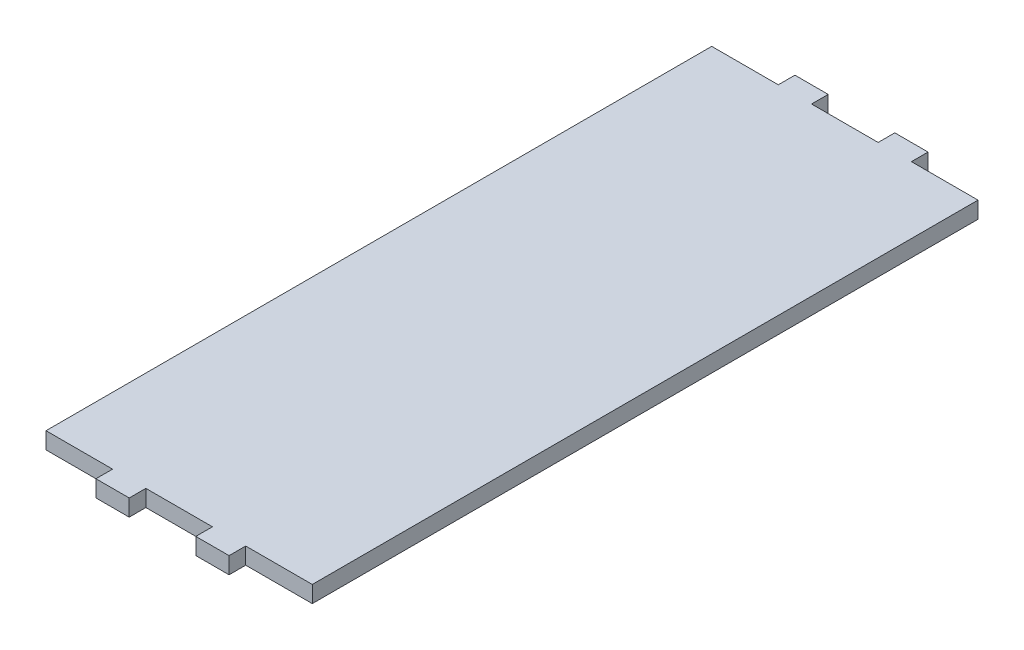
ISO-10303-21;
HEADER;
FILE_DESCRIPTION(('STEP AP214'),'2;1');
FILE_NAME('part.step','',(''),(''),'','','');
FILE_SCHEMA(('AUTOMOTIVE_DESIGN { 1 0 10303 214 1 1 1 1 }'));
ENDSEC;
DATA;
#1=APPLICATION_CONTEXT('core data for automotive mechanical design processes');
#2=APPLICATION_PROTOCOL_DEFINITION('international standard','automotive_design',2000,#1);
#3=PRODUCT_CONTEXT('',#1,'mechanical');
#4=PRODUCT('Part','Part','',(#3));
#5=PRODUCT_RELATED_PRODUCT_CATEGORY('part','',(#4));
#6=PRODUCT_DEFINITION_FORMATION('','',#4);
#7=PRODUCT_DEFINITION_CONTEXT('part definition',#1,'design');
#8=PRODUCT_DEFINITION('design','',#6,#7);
#9=PRODUCT_DEFINITION_SHAPE('','',#8);
#10=(LENGTH_UNIT() NAMED_UNIT(*) SI_UNIT(.MILLI.,.METRE.));
#11=(NAMED_UNIT(*) PLANE_ANGLE_UNIT() SI_UNIT($,.RADIAN.));
#12=(NAMED_UNIT(*) SI_UNIT($,.STERADIAN.) SOLID_ANGLE_UNIT());
#13=UNCERTAINTY_MEASURE_WITH_UNIT(LENGTH_MEASURE(1.E-05),#10,'distance_accuracy_value','');
#14=(GEOMETRIC_REPRESENTATION_CONTEXT(3) GLOBAL_UNCERTAINTY_ASSIGNED_CONTEXT((#13)) GLOBAL_UNIT_ASSIGNED_CONTEXT((#10,
#11,#12)) REPRESENTATION_CONTEXT('',''));
#15=CARTESIAN_POINT('',(0.,0.,0.));
#16=DIRECTION('',(0.,0.,1.));
#17=DIRECTION('',(1.,0.,0.));
#18=AXIS2_PLACEMENT_3D('',#15,#16,#17);
#19=CARTESIAN_POINT('',(25.4,3.175,0.));
#20=DIRECTION('',(1.,0.,0.));
#21=DIRECTION('',(0.,0.,-1.));
#22=AXIS2_PLACEMENT_3D('',#19,#20,#21);
#23=PLANE('',#22);
#24=DIRECTION('',(0.,0.,1.));
#25=VECTOR('',#24,1.);
#26=CARTESIAN_POINT('',(25.4,0.,0.));
#27=LINE('',#26,#25);
#28=CARTESIAN_POINT('',(25.4,0.,-63.5000000000001));
#29=VERTEX_POINT('',#28);
#30=CARTESIAN_POINT('',(25.4,0.,63.4999999999999));
#31=VERTEX_POINT('',#30);
#32=EDGE_CURVE('E202',#29,#31,#27,.T.);
#33=ORIENTED_EDGE('',*,*,#32,.F.);
#34=DIRECTION('',(0.,-1.,0.));
#35=VECTOR('',#34,1.);
#36=CARTESIAN_POINT('',(25.4,3.175,-63.5000000000001));
#37=LINE('',#36,#35);
#38=CARTESIAN_POINT('',(25.4,3.175,-63.5000000000001));
#39=VERTEX_POINT('',#38);
#40=EDGE_CURVE('E11',#39,#29,#37,.T.);
#41=ORIENTED_EDGE('',*,*,#40,.F.);
#42=DIRECTION('',(0.,0.,1.));
#43=VECTOR('',#42,1.);
#44=CARTESIAN_POINT('',(25.4,3.175,0.));
#45=LINE('',#44,#43);
#46=CARTESIAN_POINT('',(25.4,3.175,63.4999999999999));
#47=VERTEX_POINT('',#46);
#48=EDGE_CURVE('E296',#39,#47,#45,.T.);
#49=ORIENTED_EDGE('',*,*,#48,.T.);
#50=DIRECTION('',(0.,-1.,0.));
#51=VECTOR('',#50,1.);
#52=CARTESIAN_POINT('',(25.4,3.175,63.4999999999999));
#53=LINE('',#52,#51);
#54=EDGE_CURVE('E121',#47,#31,#53,.T.);
#55=ORIENTED_EDGE('',*,*,#54,.T.);
#56=EDGE_LOOP('',(#33,#41,#49,#55));
#57=FACE_BOUND('',#56,.T.);
#58=ADVANCED_FACE('F35',(#57),#23,.T.);
#59=CARTESIAN_POINT('',(0.,3.175,-63.5000000000001));
#60=DIRECTION('',(0.,0.,-1.));
#61=DIRECTION('',(-1.,0.,0.));
#62=AXIS2_PLACEMENT_3D('',#59,#60,#61);
#63=PLANE('',#62);
#64=DIRECTION('',(1.,0.,0.));
#65=VECTOR('',#64,1.);
#66=CARTESIAN_POINT('',(0.,0.,-63.5000000000001));
#67=LINE('',#66,#65);
#68=CARTESIAN_POINT('',(12.7,0.,-63.5000000000001));
#69=VERTEX_POINT('',#68);
#70=EDGE_CURVE('E205',#69,#29,#67,.T.);
#71=ORIENTED_EDGE('',*,*,#70,.F.);
#72=DIRECTION('',(0.,-1.,0.));
#73=VECTOR('',#72,1.);
#74=CARTESIAN_POINT('',(12.7,3.175,-63.5000000000001));
#75=LINE('',#74,#73);
#76=CARTESIAN_POINT('',(12.7,3.175,-63.5000000000001));
#77=VERTEX_POINT('',#76);
#78=EDGE_CURVE('E43',#77,#69,#75,.T.);
#79=ORIENTED_EDGE('',*,*,#78,.F.);
#80=DIRECTION('',(1.,0.,0.));
#81=VECTOR('',#80,1.);
#82=CARTESIAN_POINT('',(0.,3.175,-63.5000000000001));
#83=LINE('',#82,#81);
#84=EDGE_CURVE('E295',#77,#39,#83,.T.);
#85=ORIENTED_EDGE('',*,*,#84,.T.);
#86=ORIENTED_EDGE('',*,*,#40,.T.);
#87=EDGE_LOOP('',(#71,#79,#85,#86));
#88=FACE_BOUND('',#87,.T.);
#89=ADVANCED_FACE('F294',(#88),#63,.T.);
#90=CARTESIAN_POINT('',(12.7,3.175,0.));
#91=DIRECTION('',(-1.,0.,0.));
#92=DIRECTION('',(0.,0.,1.));
#93=AXIS2_PLACEMENT_3D('',#90,#91,#92);
#94=PLANE('',#93);
#95=DIRECTION('',(0.,0.,-1.));
#96=VECTOR('',#95,1.);
#97=CARTESIAN_POINT('',(12.7,0.,0.));
#98=LINE('',#97,#96);
#99=CARTESIAN_POINT('',(12.7,0.,-66.6750000000001));
#100=VERTEX_POINT('',#99);
#101=EDGE_CURVE('E208',#69,#100,#98,.T.);
#102=ORIENTED_EDGE('',*,*,#101,.T.);
#103=DIRECTION('',(0.,-1.,0.));
#104=VECTOR('',#103,1.);
#105=CARTESIAN_POINT('',(12.7,3.175,-66.6750000000001));
#106=LINE('',#105,#104);
#107=CARTESIAN_POINT('',(12.7,3.175,-66.6750000000001));
#108=VERTEX_POINT('',#107);
#109=EDGE_CURVE('E280',#108,#100,#106,.T.);
#110=ORIENTED_EDGE('',*,*,#109,.F.);
#111=DIRECTION('',(0.,0.,-1.));
#112=VECTOR('',#111,1.);
#113=CARTESIAN_POINT('',(12.7,3.175,0.));
#114=LINE('',#113,#112);
#115=EDGE_CURVE('E286',#77,#108,#114,.T.);
#116=ORIENTED_EDGE('',*,*,#115,.F.);
#117=ORIENTED_EDGE('',*,*,#78,.T.);
#118=EDGE_LOOP('',(#102,#110,#116,#117));
#119=FACE_BOUND('',#118,.T.);
#120=ADVANCED_FACE('F284',(#119),#94,.F.);
#121=CARTESIAN_POINT('',(-1.45716771982052E-13,3.175,-66.675));
#122=DIRECTION('',(0.,0.,-1.));
#123=DIRECTION('',(-1.,0.,0.));
#124=AXIS2_PLACEMENT_3D('',#121,#122,#123);
#125=PLANE('',#124);
#126=DIRECTION('',(1.,0.,0.));
#127=VECTOR('',#126,1.);
#128=CARTESIAN_POINT('',(-1.45716771982052E-13,0.,-66.675));
#129=LINE('',#128,#127);
#130=CARTESIAN_POINT('',(6.35,0.,-66.675));
#131=VERTEX_POINT('',#130);
#132=EDGE_CURVE('E213',#131,#100,#129,.T.);
#133=ORIENTED_EDGE('',*,*,#132,.F.);
#134=DIRECTION('',(0.,-1.,0.));
#135=VECTOR('',#134,1.);
#136=CARTESIAN_POINT('',(6.35,3.175,-66.675));
#137=LINE('',#136,#135);
#138=CARTESIAN_POINT('',(6.35,3.175,-66.675));
#139=VERTEX_POINT('',#138);
#140=EDGE_CURVE('E278',#139,#131,#137,.T.);
#141=ORIENTED_EDGE('',*,*,#140,.F.);
#142=DIRECTION('',(1.,0.,0.));
#143=VECTOR('',#142,1.);
#144=CARTESIAN_POINT('',(-1.45716771982052E-13,3.175,-66.675));
#145=LINE('',#144,#143);
#146=EDGE_CURVE('E330',#139,#108,#145,.T.);
#147=ORIENTED_EDGE('',*,*,#146,.T.);
#148=ORIENTED_EDGE('',*,*,#109,.T.);
#149=EDGE_LOOP('',(#133,#141,#147,#148));
#150=FACE_BOUND('',#149,.T.);
#151=ADVANCED_FACE('F383',(#150),#125,.T.);
#152=CARTESIAN_POINT('',(6.35,3.175,0.));
#153=DIRECTION('',(-1.,0.,0.));
#154=DIRECTION('',(0.,0.,1.));
#155=AXIS2_PLACEMENT_3D('',#152,#153,#154);
#156=PLANE('',#155);
#157=DIRECTION('',(0.,0.,-1.));
#158=VECTOR('',#157,1.);
#159=CARTESIAN_POINT('',(6.35,0.,0.));
#160=LINE('',#159,#158);
#161=CARTESIAN_POINT('',(6.35,0.,-63.5000000000001));
#162=VERTEX_POINT('',#161);
#163=EDGE_CURVE('E216',#162,#131,#160,.T.);
#164=ORIENTED_EDGE('',*,*,#163,.F.);
#165=DIRECTION('',(0.,-1.,0.));
#166=VECTOR('',#165,1.);
#167=CARTESIAN_POINT('',(6.35,3.175,-63.5000000000001));
#168=LINE('',#167,#166);
#169=CARTESIAN_POINT('',(6.35,3.175,-63.5000000000001));
#170=VERTEX_POINT('',#169);
#171=EDGE_CURVE('E276',#170,#162,#168,.T.);
#172=ORIENTED_EDGE('',*,*,#171,.F.);
#173=DIRECTION('',(0.,0.,-1.));
#174=VECTOR('',#173,1.);
#175=CARTESIAN_POINT('',(6.35,3.175,0.));
#176=LINE('',#175,#174);
#177=EDGE_CURVE('E327',#170,#139,#176,.T.);
#178=ORIENTED_EDGE('',*,*,#177,.T.);
#179=ORIENTED_EDGE('',*,*,#140,.T.);
#180=EDGE_LOOP('',(#164,#172,#178,#179));
#181=FACE_BOUND('',#180,.T.);
#182=ADVANCED_FACE('F347',(#181),#156,.T.);
#183=CARTESIAN_POINT('',(-6.35,0.,-63.5000000000001));
#184=VERTEX_POINT('',#183);
#185=EDGE_CURVE('E210',#184,#162,#67,.T.);
#186=ORIENTED_EDGE('',*,*,#185,.F.);
#187=DIRECTION('',(0.,-1.,0.));
#188=VECTOR('',#187,1.);
#189=CARTESIAN_POINT('',(-6.35,3.175,-63.5000000000001));
#190=LINE('',#189,#188);
#191=CARTESIAN_POINT('',(-6.35,3.175,-63.5000000000001));
#192=VERTEX_POINT('',#191);
#193=EDGE_CURVE('E274',#192,#184,#190,.T.);
#194=ORIENTED_EDGE('',*,*,#193,.F.);
#195=EDGE_CURVE('E326',#192,#170,#83,.T.);
#196=ORIENTED_EDGE('',*,*,#195,.T.);
#197=ORIENTED_EDGE('',*,*,#171,.T.);
#198=EDGE_LOOP('',(#186,#194,#196,#197));
#199=FACE_BOUND('',#198,.T.);
#200=ADVANCED_FACE('F339',(#199),#63,.T.);
#201=CARTESIAN_POINT('',(-6.35,3.175,0.));
#202=DIRECTION('',(-1.,0.,0.));
#203=DIRECTION('',(0.,0.,1.));
#204=AXIS2_PLACEMENT_3D('',#201,#202,#203);
#205=PLANE('',#204);
#206=DIRECTION('',(0.,0.,-1.));
#207=VECTOR('',#206,1.);
#208=CARTESIAN_POINT('',(-6.35,0.,0.));
#209=LINE('',#208,#207);
#210=CARTESIAN_POINT('',(-6.35,0.,-66.675));
#211=VERTEX_POINT('',#210);
#212=EDGE_CURVE('E219',#184,#211,#209,.T.);
#213=ORIENTED_EDGE('',*,*,#212,.T.);
#214=DIRECTION('',(0.,-1.,0.));
#215=VECTOR('',#214,1.);
#216=CARTESIAN_POINT('',(-6.35,3.175,-66.675));
#217=LINE('',#216,#215);
#218=CARTESIAN_POINT('',(-6.35,3.175,-66.675));
#219=VERTEX_POINT('',#218);
#220=EDGE_CURVE('E272',#219,#211,#217,.T.);
#221=ORIENTED_EDGE('',*,*,#220,.F.);
#222=DIRECTION('',(0.,0.,-1.));
#223=VECTOR('',#222,1.);
#224=CARTESIAN_POINT('',(-6.35,3.175,0.));
#225=LINE('',#224,#223);
#226=EDGE_CURVE('E324',#192,#219,#225,.T.);
#227=ORIENTED_EDGE('',*,*,#226,.F.);
#228=ORIENTED_EDGE('',*,*,#193,.T.);
#229=EDGE_LOOP('',(#213,#221,#227,#228));
#230=FACE_BOUND('',#229,.T.);
#231=ADVANCED_FACE('F366',(#230),#205,.F.);
#232=CARTESIAN_POINT('',(1.45716771982052E-13,3.175,-66.675));
#233=DIRECTION('',(0.,0.,-1.));
#234=DIRECTION('',(-1.,0.,0.));
#235=AXIS2_PLACEMENT_3D('',#232,#233,#234);
#236=PLANE('',#235);
#237=DIRECTION('',(1.,0.,0.));
#238=VECTOR('',#237,1.);
#239=CARTESIAN_POINT('',(1.45716771982052E-13,0.,-66.675));
#240=LINE('',#239,#238);
#241=CARTESIAN_POINT('',(-12.7,0.,-66.6750000000001));
#242=VERTEX_POINT('',#241);
#243=EDGE_CURVE('E222',#242,#211,#240,.T.);
#244=ORIENTED_EDGE('',*,*,#243,.F.);
#245=DIRECTION('',(0.,-1.,0.));
#246=VECTOR('',#245,1.);
#247=CARTESIAN_POINT('',(-12.7,3.175,-66.6750000000001));
#248=LINE('',#247,#246);
#249=CARTESIAN_POINT('',(-12.7,3.175,-66.6750000000001));
#250=VERTEX_POINT('',#249);
#251=EDGE_CURVE('E270',#250,#242,#248,.T.);
#252=ORIENTED_EDGE('',*,*,#251,.F.);
#253=DIRECTION('',(1.,0.,0.));
#254=VECTOR('',#253,1.);
#255=CARTESIAN_POINT('',(1.45716771982052E-13,3.175,-66.675));
#256=LINE('',#255,#254);
#257=EDGE_CURVE('E321',#250,#219,#256,.T.);
#258=ORIENTED_EDGE('',*,*,#257,.T.);
#259=ORIENTED_EDGE('',*,*,#220,.T.);
#260=EDGE_LOOP('',(#244,#252,#258,#259));
#261=FACE_BOUND('',#260,.T.);
#262=ADVANCED_FACE('F364',(#261),#236,.T.);
#263=CARTESIAN_POINT('',(-12.7,3.175,0.));
#264=DIRECTION('',(-1.,0.,0.));
#265=DIRECTION('',(0.,0.,1.));
#266=AXIS2_PLACEMENT_3D('',#263,#264,#265);
#267=PLANE('',#266);
#268=DIRECTION('',(0.,0.,-1.));
#269=VECTOR('',#268,1.);
#270=CARTESIAN_POINT('',(-12.7,0.,0.));
#271=LINE('',#270,#269);
#272=CARTESIAN_POINT('',(-12.7,0.,-63.5000000000001));
#273=VERTEX_POINT('',#272);
#274=EDGE_CURVE('E225',#273,#242,#271,.T.);
#275=ORIENTED_EDGE('',*,*,#274,.F.);
#276=DIRECTION('',(0.,-1.,0.));
#277=VECTOR('',#276,1.);
#278=CARTESIAN_POINT('',(-12.7,3.175,-63.5000000000001));
#279=LINE('',#278,#277);
#280=CARTESIAN_POINT('',(-12.7,3.175,-63.5000000000001));
#281=VERTEX_POINT('',#280);
#282=EDGE_CURVE('E268',#281,#273,#279,.T.);
#283=ORIENTED_EDGE('',*,*,#282,.F.);
#284=DIRECTION('',(0.,0.,-1.));
#285=VECTOR('',#284,1.);
#286=CARTESIAN_POINT('',(-12.7,3.175,0.));
#287=LINE('',#286,#285);
#288=EDGE_CURVE('E318',#281,#250,#287,.T.);
#289=ORIENTED_EDGE('',*,*,#288,.T.);
#290=ORIENTED_EDGE('',*,*,#251,.T.);
#291=EDGE_LOOP('',(#275,#283,#289,#290));
#292=FACE_BOUND('',#291,.T.);
#293=ADVANCED_FACE('F361',(#292),#267,.T.);
#294=CARTESIAN_POINT('',(-25.4,0.,-63.5000000000001));
#295=VERTEX_POINT('',#294);
#296=EDGE_CURVE('E209',#295,#273,#67,.T.);
#297=ORIENTED_EDGE('',*,*,#296,.F.);
#298=DIRECTION('',(0.,-1.,0.));
#299=VECTOR('',#298,1.);
#300=CARTESIAN_POINT('',(-25.4,3.175,-63.5000000000001));
#301=LINE('',#300,#299);
#302=CARTESIAN_POINT('',(-25.4,3.175,-63.5000000000001));
#303=VERTEX_POINT('',#302);
#304=EDGE_CURVE('E266',#303,#295,#301,.T.);
#305=ORIENTED_EDGE('',*,*,#304,.F.);
#306=EDGE_CURVE('E317',#303,#281,#83,.T.);
#307=ORIENTED_EDGE('',*,*,#306,.T.);
#308=ORIENTED_EDGE('',*,*,#282,.T.);
#309=EDGE_LOOP('',(#297,#305,#307,#308));
#310=FACE_BOUND('',#309,.T.);
#311=ADVANCED_FACE('F356',(#310),#63,.T.);
#312=CARTESIAN_POINT('',(-25.4,3.175,0.));
#313=DIRECTION('',(1.,0.,0.));
#314=DIRECTION('',(0.,0.,-1.));
#315=AXIS2_PLACEMENT_3D('',#312,#313,#314);
#316=PLANE('',#315);
#317=DIRECTION('',(0.,0.,1.));
#318=VECTOR('',#317,1.);
#319=CARTESIAN_POINT('',(-25.4,0.,0.));
#320=LINE('',#319,#318);
#321=CARTESIAN_POINT('',(-25.4,0.,63.4999999999999));
#322=VERTEX_POINT('',#321);
#323=EDGE_CURVE('E228',#295,#322,#320,.T.);
#324=ORIENTED_EDGE('',*,*,#323,.T.);
#325=DIRECTION('',(0.,-1.,0.));
#326=VECTOR('',#325,1.);
#327=CARTESIAN_POINT('',(-25.4,3.175,63.4999999999999));
#328=LINE('',#327,#326);
#329=CARTESIAN_POINT('',(-25.4,3.175,63.4999999999999));
#330=VERTEX_POINT('',#329);
#331=EDGE_CURVE('E263',#330,#322,#328,.T.);
#332=ORIENTED_EDGE('',*,*,#331,.F.);
#333=DIRECTION('',(0.,0.,1.));
#334=VECTOR('',#333,1.);
#335=CARTESIAN_POINT('',(-25.4,3.175,0.));
#336=LINE('',#335,#334);
#337=EDGE_CURVE('E315',#303,#330,#336,.T.);
#338=ORIENTED_EDGE('',*,*,#337,.F.);
#339=ORIENTED_EDGE('',*,*,#304,.T.);
#340=EDGE_LOOP('',(#324,#332,#338,#339));
#341=FACE_BOUND('',#340,.T.);
#342=ADVANCED_FACE('F387',(#341),#316,.F.);
#343=CARTESIAN_POINT('',(0.,3.175,63.4999999999999));
#344=DIRECTION('',(0.,0.,-1.));
#345=DIRECTION('',(-1.,0.,0.));
#346=AXIS2_PLACEMENT_3D('',#343,#344,#345);
#347=PLANE('',#346);
#348=DIRECTION('',(1.,0.,0.));
#349=VECTOR('',#348,1.);
#350=CARTESIAN_POINT('',(0.,0.,63.4999999999999));
#351=LINE('',#350,#349);
#352=CARTESIAN_POINT('',(-12.7,0.,63.4999999999999));
#353=VERTEX_POINT('',#352);
#354=EDGE_CURVE('E230',#322,#353,#351,.T.);
#355=ORIENTED_EDGE('',*,*,#354,.T.);
#356=DIRECTION('',(0.,-1.,0.));
#357=VECTOR('',#356,1.);
#358=CARTESIAN_POINT('',(-12.7,3.175,63.4999999999999));
#359=LINE('',#358,#357);
#360=CARTESIAN_POINT('',(-12.7,3.175,63.4999999999999));
#361=VERTEX_POINT('',#360);
#362=EDGE_CURVE('E260',#361,#353,#359,.T.);
#363=ORIENTED_EDGE('',*,*,#362,.F.);
#364=DIRECTION('',(1.,0.,0.));
#365=VECTOR('',#364,1.);
#366=CARTESIAN_POINT('',(0.,3.175,63.4999999999999));
#367=LINE('',#366,#365);
#368=EDGE_CURVE('E199',#330,#361,#367,.T.);
#369=ORIENTED_EDGE('',*,*,#368,.F.);
#370=ORIENTED_EDGE('',*,*,#331,.T.);
#371=EDGE_LOOP('',(#355,#363,#369,#370));
#372=FACE_BOUND('',#371,.T.);
#373=ADVANCED_FACE('F392',(#372),#347,.F.);
#374=CARTESIAN_POINT('',(-12.7,3.175,0.));
#375=DIRECTION('',(1.,0.,0.));
#376=DIRECTION('',(0.,0.,-1.));
#377=AXIS2_PLACEMENT_3D('',#374,#375,#376);
#378=PLANE('',#377);
#379=DIRECTION('',(0.,0.,1.));
#380=VECTOR('',#379,1.);
#381=CARTESIAN_POINT('',(-12.7,0.,0.));
#382=LINE('',#381,#380);
#383=CARTESIAN_POINT('',(-12.7,0.,66.6749999999999));
#384=VERTEX_POINT('',#383);
#385=EDGE_CURVE('E232',#353,#384,#382,.T.);
#386=ORIENTED_EDGE('',*,*,#385,.T.);
#387=DIRECTION('',(0.,-1.,0.));
#388=VECTOR('',#387,1.);
#389=CARTESIAN_POINT('',(-12.7,3.175,66.6749999999999));
#390=LINE('',#389,#388);
#391=CARTESIAN_POINT('',(-12.7,3.175,66.6749999999999));
#392=VERTEX_POINT('',#391);
#393=EDGE_CURVE('E257',#392,#384,#390,.T.);
#394=ORIENTED_EDGE('',*,*,#393,.F.);
#395=DIRECTION('',(0.,0.,1.));
#396=VECTOR('',#395,1.);
#397=CARTESIAN_POINT('',(-12.7,3.175,0.));
#398=LINE('',#397,#396);
#399=EDGE_CURVE('E313',#361,#392,#398,.T.);
#400=ORIENTED_EDGE('',*,*,#399,.F.);
#401=ORIENTED_EDGE('',*,*,#362,.T.);
#402=EDGE_LOOP('',(#386,#394,#400,#401));
#403=FACE_BOUND('',#402,.T.);
#404=ADVANCED_FACE('F479',(#403),#378,.F.);
#405=CARTESIAN_POINT('',(0.,3.175,66.6749999999999));
#406=DIRECTION('',(0.,0.,-1.));
#407=DIRECTION('',(-1.,0.,0.));
#408=AXIS2_PLACEMENT_3D('',#405,#406,#407);
#409=PLANE('',#408);
#410=DIRECTION('',(1.,0.,0.));
#411=VECTOR('',#410,1.);
#412=CARTESIAN_POINT('',(0.,0.,66.6749999999999));
#413=LINE('',#412,#411);
#414=CARTESIAN_POINT('',(-6.35,0.,66.6749999999999));
#415=VERTEX_POINT('',#414);
#416=EDGE_CURVE('E236',#384,#415,#413,.T.);
#417=ORIENTED_EDGE('',*,*,#416,.T.);
#418=DIRECTION('',(0.,-1.,0.));
#419=VECTOR('',#418,1.);
#420=CARTESIAN_POINT('',(-6.35,3.175,66.6749999999999));
#421=LINE('',#420,#419);
#422=CARTESIAN_POINT('',(-6.35,3.175,66.6749999999999));
#423=VERTEX_POINT('',#422);
#424=EDGE_CURVE('E255',#423,#415,#421,.T.);
#425=ORIENTED_EDGE('',*,*,#424,.F.);
#426=DIRECTION('',(1.,0.,0.));
#427=VECTOR('',#426,1.);
#428=CARTESIAN_POINT('',(0.,3.175,66.6749999999999));
#429=LINE('',#428,#427);
#430=EDGE_CURVE('E311',#392,#423,#429,.T.);
#431=ORIENTED_EDGE('',*,*,#430,.F.);
#432=ORIENTED_EDGE('',*,*,#393,.T.);
#433=EDGE_LOOP('',(#417,#425,#431,#432));
#434=FACE_BOUND('',#433,.T.);
#435=ADVANCED_FACE('F495',(#434),#409,.F.);
#436=CARTESIAN_POINT('',(-6.35,3.175,0.));
#437=DIRECTION('',(1.,0.,0.));
#438=DIRECTION('',(0.,0.,-1.));
#439=AXIS2_PLACEMENT_3D('',#436,#437,#438);
#440=PLANE('',#439);
#441=DIRECTION('',(0.,0.,1.));
#442=VECTOR('',#441,1.);
#443=CARTESIAN_POINT('',(-6.35,0.,0.));
#444=LINE('',#443,#442);
#445=CARTESIAN_POINT('',(-6.35,0.,63.4999999999999));
#446=VERTEX_POINT('',#445);
#447=EDGE_CURVE('E239',#446,#415,#444,.T.);
#448=ORIENTED_EDGE('',*,*,#447,.F.);
#449=DIRECTION('',(0.,-1.,0.));
#450=VECTOR('',#449,1.);
#451=CARTESIAN_POINT('',(-6.35,3.175,63.4999999999999));
#452=LINE('',#451,#450);
#453=CARTESIAN_POINT('',(-6.35,3.175,63.4999999999999));
#454=VERTEX_POINT('',#453);
#455=EDGE_CURVE('E253',#454,#446,#452,.T.);
#456=ORIENTED_EDGE('',*,*,#455,.F.);
#457=DIRECTION('',(0.,0.,1.));
#458=VECTOR('',#457,1.);
#459=CARTESIAN_POINT('',(-6.35,3.175,0.));
#460=LINE('',#459,#458);
#461=EDGE_CURVE('E307',#454,#423,#460,.T.);
#462=ORIENTED_EDGE('',*,*,#461,.T.);
#463=ORIENTED_EDGE('',*,*,#424,.T.);
#464=EDGE_LOOP('',(#448,#456,#462,#463));
#465=FACE_BOUND('',#464,.T.);
#466=ADVANCED_FACE('F504',(#465),#440,.T.);
#467=CARTESIAN_POINT('',(6.35,0.,63.4999999999999));
#468=VERTEX_POINT('',#467);
#469=EDGE_CURVE('E234',#446,#468,#351,.T.);
#470=ORIENTED_EDGE('',*,*,#469,.T.);
#471=DIRECTION('',(0.,-1.,0.));
#472=VECTOR('',#471,1.);
#473=CARTESIAN_POINT('',(6.35,3.175,63.4999999999999));
#474=LINE('',#473,#472);
#475=CARTESIAN_POINT('',(6.35,3.175,63.4999999999999));
#476=VERTEX_POINT('',#475);
#477=EDGE_CURVE('E250',#476,#468,#474,.T.);
#478=ORIENTED_EDGE('',*,*,#477,.F.);
#479=EDGE_CURVE('E198',#454,#476,#367,.T.);
#480=ORIENTED_EDGE('',*,*,#479,.F.);
#481=ORIENTED_EDGE('',*,*,#455,.T.);
#482=EDGE_LOOP('',(#470,#478,#480,#481));
#483=FACE_BOUND('',#482,.T.);
#484=ADVANCED_FACE('F301',(#483),#347,.F.);
#485=CARTESIAN_POINT('',(6.35,3.175,0.));
#486=DIRECTION('',(1.,0.,0.));
#487=DIRECTION('',(0.,0.,-1.));
#488=AXIS2_PLACEMENT_3D('',#485,#486,#487);
#489=PLANE('',#488);
#490=DIRECTION('',(0.,0.,1.));
#491=VECTOR('',#490,1.);
#492=CARTESIAN_POINT('',(6.35,0.,0.));
#493=LINE('',#492,#491);
#494=CARTESIAN_POINT('',(6.35,0.,66.6749999999999));
#495=VERTEX_POINT('',#494);
#496=EDGE_CURVE('E242',#468,#495,#493,.T.);
#497=ORIENTED_EDGE('',*,*,#496,.T.);
#498=DIRECTION('',(0.,-1.,0.));
#499=VECTOR('',#498,1.);
#500=CARTESIAN_POINT('',(6.35,3.175,66.6749999999999));
#501=LINE('',#500,#499);
#502=CARTESIAN_POINT('',(6.35,3.175,66.6749999999999));
#503=VERTEX_POINT('',#502);
#504=EDGE_CURVE('E193',#503,#495,#501,.T.);
#505=ORIENTED_EDGE('',*,*,#504,.F.);
#506=DIRECTION('',(0.,0.,1.));
#507=VECTOR('',#506,1.);
#508=CARTESIAN_POINT('',(6.35,3.175,0.));
#509=LINE('',#508,#507);
#510=EDGE_CURVE('E180',#476,#503,#509,.T.);
#511=ORIENTED_EDGE('',*,*,#510,.F.);
#512=ORIENTED_EDGE('',*,*,#477,.T.);
#513=EDGE_LOOP('',(#497,#505,#511,#512));
#514=FACE_BOUND('',#513,.T.);
#515=ADVANCED_FACE('F306',(#514),#489,.F.);
#516=CARTESIAN_POINT('',(0.,3.175,66.6749999999999));
#517=DIRECTION('',(0.,0.,-1.));
#518=DIRECTION('',(-1.,0.,0.));
#519=AXIS2_PLACEMENT_3D('',#516,#517,#518);
#520=PLANE('',#519);
#521=DIRECTION('',(1.,0.,0.));
#522=VECTOR('',#521,1.);
#523=CARTESIAN_POINT('',(0.,0.,66.6749999999999));
#524=LINE('',#523,#522);
#525=CARTESIAN_POINT('',(12.7,0.,66.6749999999999));
#526=VERTEX_POINT('',#525);
#527=EDGE_CURVE('E189',#495,#526,#524,.T.);
#528=ORIENTED_EDGE('',*,*,#527,.T.);
#529=DIRECTION('',(0.,-1.,0.));
#530=VECTOR('',#529,1.);
#531=CARTESIAN_POINT('',(12.7,3.175,66.6749999999999));
#532=LINE('',#531,#530);
#533=CARTESIAN_POINT('',(12.7,3.175,66.6749999999999));
#534=VERTEX_POINT('',#533);
#535=EDGE_CURVE('E186',#534,#526,#532,.T.);
#536=ORIENTED_EDGE('',*,*,#535,.F.);
#537=DIRECTION('',(1.,0.,0.));
#538=VECTOR('',#537,1.);
#539=CARTESIAN_POINT('',(0.,3.175,66.6749999999999));
#540=LINE('',#539,#538);
#541=EDGE_CURVE('E174',#503,#534,#540,.T.);
#542=ORIENTED_EDGE('',*,*,#541,.F.);
#543=ORIENTED_EDGE('',*,*,#504,.T.);
#544=EDGE_LOOP('',(#528,#536,#542,#543));
#545=FACE_BOUND('',#544,.T.);
#546=ADVANCED_FACE('F187',(#545),#520,.F.);
#547=CARTESIAN_POINT('',(12.7,3.175,0.));
#548=DIRECTION('',(1.,0.,0.));
#549=DIRECTION('',(0.,0.,-1.));
#550=AXIS2_PLACEMENT_3D('',#547,#548,#549);
#551=PLANE('',#550);
#552=DIRECTION('',(0.,0.,1.));
#553=VECTOR('',#552,1.);
#554=CARTESIAN_POINT('',(12.7,0.,0.));
#555=LINE('',#554,#553);
#556=CARTESIAN_POINT('',(12.7,0.,63.4999999999999));
#557=VERTEX_POINT('',#556);
#558=EDGE_CURVE('E245',#557,#526,#555,.T.);
#559=ORIENTED_EDGE('',*,*,#558,.F.);
#560=DIRECTION('',(0.,-1.,0.));
#561=VECTOR('',#560,1.);
#562=CARTESIAN_POINT('',(12.7,3.175,63.4999999999999));
#563=LINE('',#562,#561);
#564=CARTESIAN_POINT('',(12.7,3.175,63.4999999999999));
#565=VERTEX_POINT('',#564);
#566=EDGE_CURVE('E114',#565,#557,#563,.T.);
#567=ORIENTED_EDGE('',*,*,#566,.F.);
#568=DIRECTION('',(0.,0.,1.));
#569=VECTOR('',#568,1.);
#570=CARTESIAN_POINT('',(12.7,3.175,0.));
#571=LINE('',#570,#569);
#572=EDGE_CURVE('E178',#565,#534,#571,.T.);
#573=ORIENTED_EDGE('',*,*,#572,.T.);
#574=ORIENTED_EDGE('',*,*,#535,.T.);
#575=EDGE_LOOP('',(#559,#567,#573,#574));
#576=FACE_BOUND('',#575,.T.);
#577=ADVANCED_FACE('F195',(#576),#551,.T.);
#578=EDGE_CURVE('E233',#557,#31,#351,.T.);
#579=ORIENTED_EDGE('',*,*,#578,.T.);
#580=ORIENTED_EDGE('',*,*,#54,.F.);
#581=EDGE_CURVE('E51',#565,#47,#367,.T.);
#582=ORIENTED_EDGE('',*,*,#581,.F.);
#583=ORIENTED_EDGE('',*,*,#566,.T.);
#584=EDGE_LOOP('',(#579,#580,#582,#583));
#585=FACE_BOUND('',#584,.T.);
#586=ADVANCED_FACE('F482',(#585),#347,.F.);
#587=CARTESIAN_POINT('',(0.,3.175,0.));
#588=DIRECTION('',(0.,1.,0.));
#589=DIRECTION('',(0.,0.,1.));
#590=AXIS2_PLACEMENT_3D('',#587,#588,#589);
#591=PLANE('',#590);
#592=ORIENTED_EDGE('',*,*,#48,.F.);
#593=ORIENTED_EDGE('',*,*,#84,.F.);
#594=ORIENTED_EDGE('',*,*,#115,.T.);
#595=ORIENTED_EDGE('',*,*,#146,.F.);
#596=ORIENTED_EDGE('',*,*,#177,.F.);
#597=ORIENTED_EDGE('',*,*,#195,.F.);
#598=ORIENTED_EDGE('',*,*,#226,.T.);
#599=ORIENTED_EDGE('',*,*,#257,.F.);
#600=ORIENTED_EDGE('',*,*,#288,.F.);
#601=ORIENTED_EDGE('',*,*,#306,.F.);
#602=ORIENTED_EDGE('',*,*,#337,.T.);
#603=ORIENTED_EDGE('',*,*,#368,.T.);
#604=ORIENTED_EDGE('',*,*,#399,.T.);
#605=ORIENTED_EDGE('',*,*,#430,.T.);
#606=ORIENTED_EDGE('',*,*,#461,.F.);
#607=ORIENTED_EDGE('',*,*,#479,.T.);
#608=ORIENTED_EDGE('',*,*,#510,.T.);
#609=ORIENTED_EDGE('',*,*,#541,.T.);
#610=ORIENTED_EDGE('',*,*,#572,.F.);
#611=ORIENTED_EDGE('',*,*,#581,.T.);
#612=EDGE_LOOP('',(#592,#593,#594,#595,#596,#597,#598,#599,#600,#601,#602,#603,#604,#605,#606,
#607,#608,#609,#610,#611));
#613=FACE_BOUND('',#612,.T.);
#614=ADVANCED_FACE('F176',(#613),#591,.T.);
#615=CARTESIAN_POINT('',(0.,0.,0.));
#616=DIRECTION('',(0.,1.,0.));
#617=DIRECTION('',(0.,0.,1.));
#618=AXIS2_PLACEMENT_3D('',#615,#616,#617);
#619=PLANE('',#618);
#620=ORIENTED_EDGE('',*,*,#32,.T.);
#621=ORIENTED_EDGE('',*,*,#578,.F.);
#622=ORIENTED_EDGE('',*,*,#558,.T.);
#623=ORIENTED_EDGE('',*,*,#527,.F.);
#624=ORIENTED_EDGE('',*,*,#496,.F.);
#625=ORIENTED_EDGE('',*,*,#469,.F.);
#626=ORIENTED_EDGE('',*,*,#447,.T.);
#627=ORIENTED_EDGE('',*,*,#416,.F.);
#628=ORIENTED_EDGE('',*,*,#385,.F.);
#629=ORIENTED_EDGE('',*,*,#354,.F.);
#630=ORIENTED_EDGE('',*,*,#323,.F.);
#631=ORIENTED_EDGE('',*,*,#296,.T.);
#632=ORIENTED_EDGE('',*,*,#274,.T.);
#633=ORIENTED_EDGE('',*,*,#243,.T.);
#634=ORIENTED_EDGE('',*,*,#212,.F.);
#635=ORIENTED_EDGE('',*,*,#185,.T.);
#636=ORIENTED_EDGE('',*,*,#163,.T.);
#637=ORIENTED_EDGE('',*,*,#132,.T.);
#638=ORIENTED_EDGE('',*,*,#101,.F.);
#639=ORIENTED_EDGE('',*,*,#70,.T.);
#640=EDGE_LOOP('',(#620,#621,#622,#623,#624,#625,#626,#627,#628,#629,#630,#631,#632,#633,#634,
#635,#636,#637,#638,#639));
#641=FACE_BOUND('',#640,.T.);
#642=ADVANCED_FACE('F292',(#641),#619,.F.);
#643=CLOSED_SHELL('',(#58,#89,#120,#151,#182,#200,#231,#262,#293,#311,#342,#373,#404,#435,#466,
#484,#515,#546,#577,#586,#614,#642));
#644=MANIFOLD_SOLID_BREP('B2',#643);
#645=ADVANCED_BREP_SHAPE_REPRESENTATION('',(#18,#644),#14);
#646=SHAPE_DEFINITION_REPRESENTATION(#9,#645);
ENDSEC;
END-ISO-10303-21;
